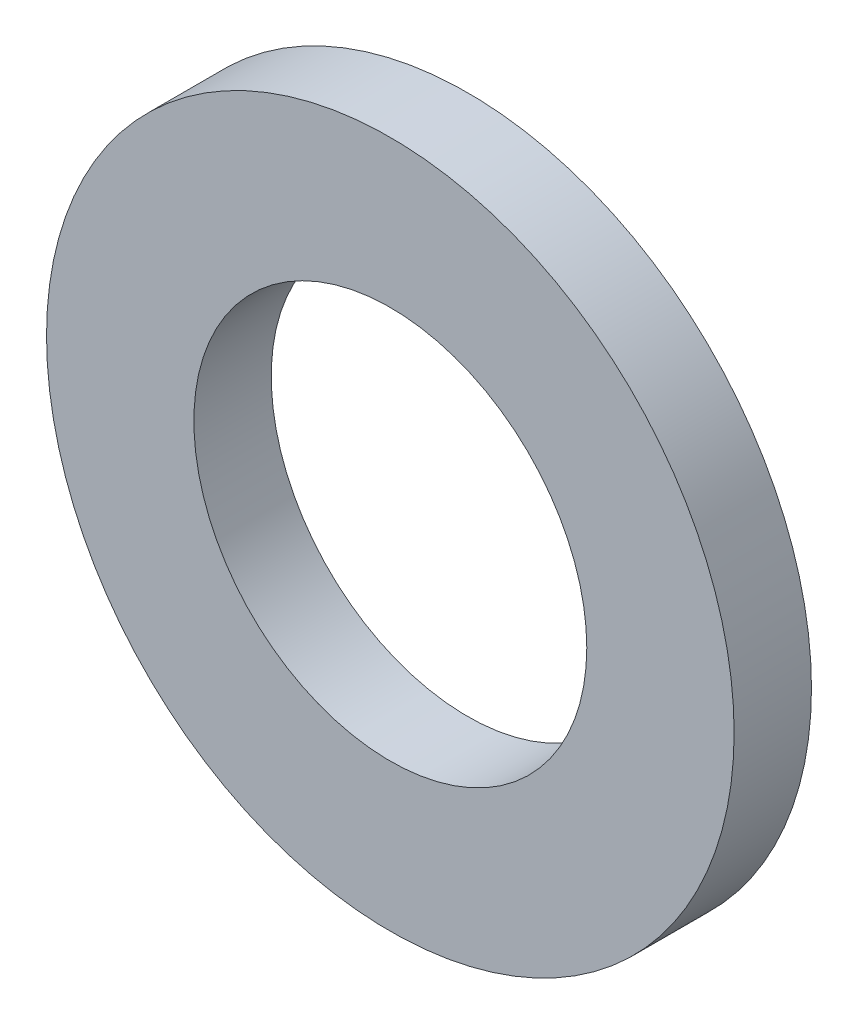
ISO-10303-21;
HEADER;
FILE_DESCRIPTION(('STEP AP214'),'2;1');
FILE_NAME('part.step','',(''),(''),'','','');
FILE_SCHEMA(('AUTOMOTIVE_DESIGN { 1 0 10303 214 1 1 1 1 }'));
ENDSEC;
DATA;
#1=APPLICATION_CONTEXT('core data for automotive mechanical design processes');
#2=APPLICATION_PROTOCOL_DEFINITION('international standard','automotive_design',2000,#1);
#3=PRODUCT_CONTEXT('',#1,'mechanical');
#4=PRODUCT('Part','Part','',(#3));
#5=PRODUCT_RELATED_PRODUCT_CATEGORY('part','',(#4));
#6=PRODUCT_DEFINITION_FORMATION('','',#4);
#7=PRODUCT_DEFINITION_CONTEXT('part definition',#1,'design');
#8=PRODUCT_DEFINITION('design','',#6,#7);
#9=PRODUCT_DEFINITION_SHAPE('','',#8);
#10=(LENGTH_UNIT() NAMED_UNIT(*) SI_UNIT(.MILLI.,.METRE.));
#11=(NAMED_UNIT(*) PLANE_ANGLE_UNIT() SI_UNIT($,.RADIAN.));
#12=(NAMED_UNIT(*) SI_UNIT($,.STERADIAN.) SOLID_ANGLE_UNIT());
#13=UNCERTAINTY_MEASURE_WITH_UNIT(LENGTH_MEASURE(1.E-05),#10,'distance_accuracy_value','');
#14=(GEOMETRIC_REPRESENTATION_CONTEXT(3) GLOBAL_UNCERTAINTY_ASSIGNED_CONTEXT((#13)) GLOBAL_UNIT_ASSIGNED_CONTEXT((#10,
#11,#12)) REPRESENTATION_CONTEXT('',''));
#15=CARTESIAN_POINT('',(0.,0.,0.));
#16=DIRECTION('',(0.,0.,1.));
#17=DIRECTION('',(1.,0.,0.));
#18=AXIS2_PLACEMENT_3D('',#15,#16,#17);
#19=CARTESIAN_POINT('',(0.,0.,0.));
#20=DIRECTION('',(0.,0.,-1.));
#21=DIRECTION('',(1.,0.,0.));
#22=AXIS2_PLACEMENT_3D('',#19,#20,#21);
#23=CYLINDRICAL_SURFACE('',#22,0.889);
#24=CARTESIAN_POINT('',(0.,0.,0.1999996));
#25=DIRECTION('',(0.,0.,1.));
#26=DIRECTION('',(1.,0.,0.));
#27=AXIS2_PLACEMENT_3D('',#24,#25,#26);
#28=CIRCLE('',#27,0.889);
#29=CARTESIAN_POINT('',(0.889,0.,0.1999996));
#30=VERTEX_POINT('',#29);
#31=EDGE_CURVE('E11',#30,#30,#28,.T.);
#32=ORIENTED_EDGE('',*,*,#31,.F.);
#33=DIRECTION('',(0.,0.,1.));
#34=VECTOR('',#33,1.);
#35=CARTESIAN_POINT('',(0.889,0.,0.));
#36=LINE('',#35,#34);
#37=CARTESIAN_POINT('',(0.889,0.,0.));
#38=VERTEX_POINT('',#37);
#39=EDGE_CURVE('E24',#38,#30,#36,.T.);
#40=ORIENTED_EDGE('',*,*,#39,.F.);
#41=CARTESIAN_POINT('',(0.,0.,0.));
#42=DIRECTION('',(0.,0.,1.));
#43=DIRECTION('',(1.,0.,0.));
#44=AXIS2_PLACEMENT_3D('',#41,#42,#43);
#45=CIRCLE('',#44,0.889);
#46=EDGE_CURVE('E46',#38,#38,#45,.T.);
#47=ORIENTED_EDGE('',*,*,#46,.T.);
#48=ORIENTED_EDGE('',*,*,#39,.T.);
#49=EDGE_LOOP('',(#32,#40,#47,#48));
#50=FACE_BOUND('',#49,.T.);
#51=ADVANCED_FACE('F17',(#50),#23,.T.);
#52=CARTESIAN_POINT('',(0.,0.,0.));
#53=DIRECTION('',(0.,0.,-1.));
#54=DIRECTION('',(1.,0.,0.));
#55=AXIS2_PLACEMENT_3D('',#52,#53,#54);
#56=CYLINDRICAL_SURFACE('',#55,0.508);
#57=DIRECTION('',(0.,0.,1.));
#58=VECTOR('',#57,1.);
#59=CARTESIAN_POINT('',(0.508,0.,0.));
#60=LINE('',#59,#58);
#61=CARTESIAN_POINT('',(0.508,0.,0.));
#62=VERTEX_POINT('',#61);
#63=CARTESIAN_POINT('',(0.508,0.,0.1999996));
#64=VERTEX_POINT('',#63);
#65=EDGE_CURVE('E40',#62,#64,#60,.T.);
#66=ORIENTED_EDGE('',*,*,#65,.T.);
#67=CARTESIAN_POINT('',(0.,0.,0.1999996));
#68=DIRECTION('',(0.,0.,1.));
#69=DIRECTION('',(1.,0.,0.));
#70=AXIS2_PLACEMENT_3D('',#67,#68,#69);
#71=CIRCLE('',#70,0.508);
#72=EDGE_CURVE('E45',#64,#64,#71,.T.);
#73=ORIENTED_EDGE('',*,*,#72,.T.);
#74=ORIENTED_EDGE('',*,*,#65,.F.);
#75=CARTESIAN_POINT('',(0.,0.,0.));
#76=DIRECTION('',(0.,0.,1.));
#77=DIRECTION('',(1.,0.,0.));
#78=AXIS2_PLACEMENT_3D('',#75,#76,#77);
#79=CIRCLE('',#78,0.508);
#80=EDGE_CURVE('E43',#62,#62,#79,.T.);
#81=ORIENTED_EDGE('',*,*,#80,.F.);
#82=EDGE_LOOP('',(#66,#73,#74,#81));
#83=FACE_BOUND('',#82,.T.);
#84=ADVANCED_FACE('F42',(#83),#56,.F.);
#85=CARTESIAN_POINT('',(0.889,0.,0.));
#86=DIRECTION('',(0.,0.,-1.));
#87=DIRECTION('',(-1.,0.,0.));
#88=AXIS2_PLACEMENT_3D('',#85,#86,#87);
#89=PLANE('',#88);
#90=ORIENTED_EDGE('',*,*,#46,.F.);
#91=EDGE_LOOP('',(#90));
#92=FACE_BOUND('',#91,.T.);
#93=ORIENTED_EDGE('',*,*,#80,.T.);
#94=EDGE_LOOP('',(#93));
#95=FACE_BOUND('',#94,.T.);
#96=ADVANCED_FACE('F49',(#92,#95),#89,.T.);
#97=CARTESIAN_POINT('',(0.889,0.,0.1999996));
#98=DIRECTION('',(0.,0.,-1.));
#99=DIRECTION('',(-1.,0.,0.));
#100=AXIS2_PLACEMENT_3D('',#97,#98,#99);
#101=PLANE('',#100);
#102=ORIENTED_EDGE('',*,*,#31,.T.);
#103=EDGE_LOOP('',(#102));
#104=FACE_BOUND('',#103,.T.);
#105=ORIENTED_EDGE('',*,*,#72,.F.);
#106=EDGE_LOOP('',(#105));
#107=FACE_BOUND('',#106,.T.);
#108=ADVANCED_FACE('F56',(#104,#107),#101,.F.);
#109=CLOSED_SHELL('',(#51,#84,#96,#108));
#110=MANIFOLD_SOLID_BREP('B1',#109);
#111=ADVANCED_BREP_SHAPE_REPRESENTATION('',(#18,#110),#14);
#112=SHAPE_DEFINITION_REPRESENTATION(#9,#111);
ENDSEC;
END-ISO-10303-21;
